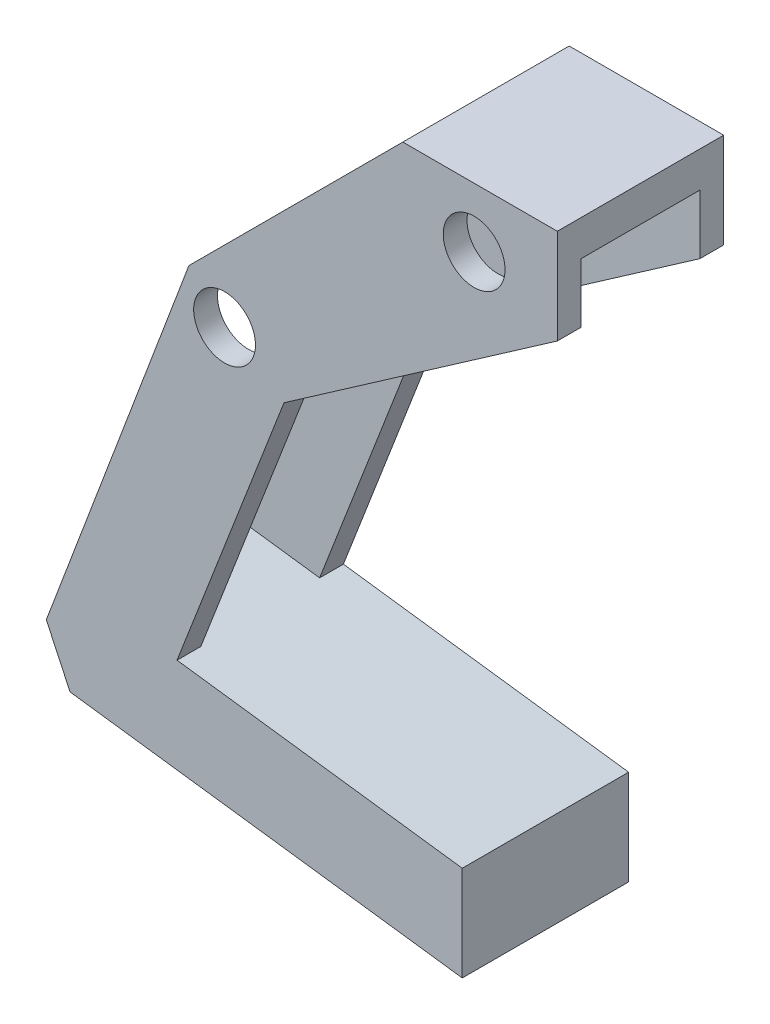
ISO-10303-21;
HEADER;
FILE_DESCRIPTION(('STEP AP214'),'2;1');
FILE_NAME('part.step','',(''),(''),'','','');
FILE_SCHEMA(('AUTOMOTIVE_DESIGN { 1 0 10303 214 1 1 1 1 }'));
ENDSEC;
DATA;
#1=APPLICATION_CONTEXT('core data for automotive mechanical design processes');
#2=APPLICATION_PROTOCOL_DEFINITION('international standard','automotive_design',2000,#1);
#3=PRODUCT_CONTEXT('',#1,'mechanical');
#4=PRODUCT('Part','Part','',(#3));
#5=PRODUCT_RELATED_PRODUCT_CATEGORY('part','',(#4));
#6=PRODUCT_DEFINITION_FORMATION('','',#4);
#7=PRODUCT_DEFINITION_CONTEXT('part definition',#1,'design');
#8=PRODUCT_DEFINITION('design','',#6,#7);
#9=PRODUCT_DEFINITION_SHAPE('','',#8);
#10=(LENGTH_UNIT() NAMED_UNIT(*) SI_UNIT(.MILLI.,.METRE.));
#11=(NAMED_UNIT(*) PLANE_ANGLE_UNIT() SI_UNIT($,.RADIAN.));
#12=(NAMED_UNIT(*) SI_UNIT($,.STERADIAN.) SOLID_ANGLE_UNIT());
#13=UNCERTAINTY_MEASURE_WITH_UNIT(LENGTH_MEASURE(1.E-05),#10,'distance_accuracy_value','');
#14=(GEOMETRIC_REPRESENTATION_CONTEXT(3) GLOBAL_UNCERTAINTY_ASSIGNED_CONTEXT((#13)) GLOBAL_UNIT_ASSIGNED_CONTEXT((#10,
#11,#12)) REPRESENTATION_CONTEXT('',''));
#15=CARTESIAN_POINT('',(0.,0.,0.));
#16=DIRECTION('',(0.,0.,1.));
#17=DIRECTION('',(1.,0.,0.));
#18=AXIS2_PLACEMENT_3D('',#15,#16,#17);
#19=CARTESIAN_POINT('',(-65.,57.,2.));
#20=DIRECTION('',(0.,1.,0.));
#21=DIRECTION('',(0.,0.,1.));
#22=AXIS2_PLACEMENT_3D('',#19,#20,#21);
#23=PLANE('',#22);
#24=DIRECTION('',(-1.,0.,0.));
#25=VECTOR('',#24,1.);
#26=CARTESIAN_POINT('',(-65.,57.,2.));
#27=LINE('',#26,#25);
#28=CARTESIAN_POINT('',(-20.6613247725836,57.,2.));
#29=VERTEX_POINT('',#28);
#30=CARTESIAN_POINT('',(-28.,57.,2.));
#31=VERTEX_POINT('',#30);
#32=EDGE_CURVE('E179',#29,#31,#27,.T.);
#33=ORIENTED_EDGE('',*,*,#32,.F.);
#34=DIRECTION('',(0.,0.,1.));
#35=VECTOR('',#34,1.);
#36=CARTESIAN_POINT('',(-20.6613247725836,57.,0.));
#37=LINE('',#36,#35);
#38=CARTESIAN_POINT('',(-20.6613247725836,57.,12.));
#39=VERTEX_POINT('',#38);
#40=EDGE_CURVE('E169',#29,#39,#37,.T.);
#41=ORIENTED_EDGE('',*,*,#40,.T.);
#42=DIRECTION('',(-1.,0.,0.));
#43=VECTOR('',#42,1.);
#44=CARTESIAN_POINT('',(-65.,57.,12.));
#45=LINE('',#44,#43);
#46=CARTESIAN_POINT('',(-28.,57.,12.));
#47=VERTEX_POINT('',#46);
#48=EDGE_CURVE('E177',#39,#47,#45,.T.);
#49=ORIENTED_EDGE('',*,*,#48,.T.);
#50=DIRECTION('',(0.,0.,1.));
#51=VECTOR('',#50,1.);
#52=CARTESIAN_POINT('',(-28.,57.,14.));
#53=LINE('',#52,#51);
#54=EDGE_CURVE('E47',#31,#47,#53,.T.);
#55=ORIENTED_EDGE('',*,*,#54,.F.);
#56=EDGE_LOOP('',(#33,#41,#49,#55));
#57=FACE_BOUND('',#56,.T.);
#58=ADVANCED_FACE('F39',(#57),#23,.F.);
#59=CARTESIAN_POINT('',(-12.,52.,14.));
#60=DIRECTION('',(-1.,0.,0.));
#61=DIRECTION('',(0.,0.,1.));
#62=AXIS2_PLACEMENT_3D('',#59,#60,#61);
#63=PLANE('',#62);
#64=DIRECTION('',(0.,1.,0.));
#65=VECTOR('',#64,1.);
#66=CARTESIAN_POINT('',(-12.,52.,2.));
#67=LINE('',#66,#65);
#68=CARTESIAN_POINT('',(-12.,52.,2.));
#69=VERTEX_POINT('',#68);
#70=CARTESIAN_POINT('',(-12.,57.,2.));
#71=VERTEX_POINT('',#70);
#72=EDGE_CURVE('E209',#69,#71,#67,.T.);
#73=ORIENTED_EDGE('',*,*,#72,.F.);
#74=DIRECTION('',(0.,0.,-1.));
#75=VECTOR('',#74,1.);
#76=CARTESIAN_POINT('',(-12.,52.,14.));
#77=LINE('',#76,#75);
#78=CARTESIAN_POINT('',(-12.,52.,0.));
#79=VERTEX_POINT('',#78);
#80=EDGE_CURVE('E244',#69,#79,#77,.T.);
#81=ORIENTED_EDGE('',*,*,#80,.T.);
#82=DIRECTION('',(0.,1.,0.));
#83=VECTOR('',#82,1.);
#84=CARTESIAN_POINT('',(-12.,52.,0.));
#85=LINE('',#84,#83);
#86=CARTESIAN_POINT('',(-12.,60.,0.));
#87=VERTEX_POINT('',#86);
#88=EDGE_CURVE('E221',#79,#87,#85,.T.);
#89=ORIENTED_EDGE('',*,*,#88,.T.);
#90=DIRECTION('',(0.,0.,-1.));
#91=VECTOR('',#90,1.);
#92=CARTESIAN_POINT('',(-12.,60.,14.));
#93=LINE('',#92,#91);
#94=CARTESIAN_POINT('',(-12.,60.,14.));
#95=VERTEX_POINT('',#94);
#96=EDGE_CURVE('E298',#95,#87,#93,.T.);
#97=ORIENTED_EDGE('',*,*,#96,.F.);
#98=DIRECTION('',(0.,1.,0.));
#99=VECTOR('',#98,1.);
#100=CARTESIAN_POINT('',(-12.,52.,14.));
#101=LINE('',#100,#99);
#102=CARTESIAN_POINT('',(-12.,52.,14.));
#103=VERTEX_POINT('',#102);
#104=EDGE_CURVE('E222',#103,#95,#101,.T.);
#105=ORIENTED_EDGE('',*,*,#104,.F.);
#106=CARTESIAN_POINT('',(-12.,52.,12.));
#107=VERTEX_POINT('',#106);
#108=EDGE_CURVE('E269',#103,#107,#77,.T.);
#109=ORIENTED_EDGE('',*,*,#108,.T.);
#110=DIRECTION('',(0.,1.,0.));
#111=VECTOR('',#110,1.);
#112=CARTESIAN_POINT('',(-12.,52.,12.));
#113=LINE('',#112,#111);
#114=CARTESIAN_POINT('',(-12.,57.,12.));
#115=VERTEX_POINT('',#114);
#116=EDGE_CURVE('E200',#107,#115,#113,.T.);
#117=ORIENTED_EDGE('',*,*,#116,.T.);
#118=DIRECTION('',(0.,0.,-1.));
#119=VECTOR('',#118,1.);
#120=CARTESIAN_POINT('',(-12.,57.,14.));
#121=LINE('',#120,#119);
#122=EDGE_CURVE('E218',#115,#71,#121,.T.);
#123=ORIENTED_EDGE('',*,*,#122,.T.);
#124=EDGE_LOOP('',(#73,#81,#89,#97,#105,#109,#117,#123));
#125=FACE_BOUND('',#124,.T.);
#126=ADVANCED_FACE('F41',(#125),#63,.F.);
#127=CARTESIAN_POINT('',(-25.,60.,14.));
#128=DIRECTION('',(0.707106781186548,-0.707106781186548,0.));
#129=DIRECTION('',(0.707106781186548,0.707106781186548,0.));
#130=AXIS2_PLACEMENT_3D('',#127,#128,#129);
#131=PLANE('',#130);
#132=DIRECTION('',(-0.707106781186548,-0.707106781186548,0.));
#133=VECTOR('',#132,1.);
#134=CARTESIAN_POINT('',(-25.,60.,2.));
#135=LINE('',#134,#133);
#136=CARTESIAN_POINT('',(-43.,42.,2.));
#137=VERTEX_POINT('',#136);
#138=EDGE_CURVE('E213',#31,#137,#135,.T.);
#139=ORIENTED_EDGE('',*,*,#138,.F.);
#140=ORIENTED_EDGE('',*,*,#54,.T.);
#141=DIRECTION('',(-0.707106781186548,-0.707106781186548,0.));
#142=VECTOR('',#141,1.);
#143=CARTESIAN_POINT('',(-25.,60.,12.));
#144=LINE('',#143,#142);
#145=CARTESIAN_POINT('',(-43.,42.,12.));
#146=VERTEX_POINT('',#145);
#147=EDGE_CURVE('E184',#47,#146,#144,.T.);
#148=ORIENTED_EDGE('',*,*,#147,.T.);
#149=DIRECTION('',(0.,0.,-1.));
#150=VECTOR('',#149,1.);
#151=CARTESIAN_POINT('',(-43.,42.,14.));
#152=LINE('',#151,#150);
#153=CARTESIAN_POINT('',(-43.,42.,14.));
#154=VERTEX_POINT('',#153);
#155=EDGE_CURVE('E292',#154,#146,#152,.T.);
#156=ORIENTED_EDGE('',*,*,#155,.F.);
#157=DIRECTION('',(-0.707106781186547,-0.707106781186547,0.));
#158=VECTOR('',#157,1.);
#159=CARTESIAN_POINT('',(-25.,60.,14.));
#160=LINE('',#159,#158);
#161=CARTESIAN_POINT('',(-25.,60.,14.));
#162=VERTEX_POINT('',#161);
#163=EDGE_CURVE('E228',#162,#154,#160,.T.);
#164=ORIENTED_EDGE('',*,*,#163,.F.);
#165=DIRECTION('',(0.,0.,-1.));
#166=VECTOR('',#165,1.);
#167=CARTESIAN_POINT('',(-25.,60.,14.));
#168=LINE('',#167,#166);
#169=CARTESIAN_POINT('',(-25.,60.,0.));
#170=VERTEX_POINT('',#169);
#171=EDGE_CURVE('E295',#162,#170,#168,.T.);
#172=ORIENTED_EDGE('',*,*,#171,.T.);
#173=DIRECTION('',(-0.707106781186547,-0.707106781186547,0.));
#174=VECTOR('',#173,1.);
#175=CARTESIAN_POINT('',(-25.,60.,0.));
#176=LINE('',#175,#174);
#177=CARTESIAN_POINT('',(-43.,42.,0.));
#178=VERTEX_POINT('',#177);
#179=EDGE_CURVE('E249',#170,#178,#176,.T.);
#180=ORIENTED_EDGE('',*,*,#179,.T.);
#181=EDGE_CURVE('E291',#137,#178,#152,.T.);
#182=ORIENTED_EDGE('',*,*,#181,.F.);
#183=EDGE_LOOP('',(#139,#140,#148,#156,#164,#172,#180,#182));
#184=FACE_BOUND('',#183,.T.);
#185=ADVANCED_FACE('F328',(#184),#131,.F.);
#186=CARTESIAN_POINT('',(-43.,42.,14.));
#187=DIRECTION('',(0.935646924127684,-0.352937435490208,0.));
#188=DIRECTION('',(0.352937435490208,0.935646924127684,0.));
#189=AXIS2_PLACEMENT_3D('',#186,#187,#188);
#190=PLANE('',#189);
#191=DIRECTION('',(-0.352937435490208,-0.935646924127684,0.));
#192=VECTOR('',#191,1.);
#193=CARTESIAN_POINT('',(-43.,42.,2.));
#194=LINE('',#193,#192);
#195=CARTESIAN_POINT('',(-53.5625369462484,13.9984217853916,2.));
#196=VERTEX_POINT('',#195);
#197=EDGE_CURVE('E211',#137,#196,#194,.T.);
#198=ORIENTED_EDGE('',*,*,#197,.F.);
#199=ORIENTED_EDGE('',*,*,#181,.T.);
#200=DIRECTION('',(-0.352937435490208,-0.935646924127684,0.));
#201=VECTOR('',#200,1.);
#202=CARTESIAN_POINT('',(-43.,42.,0.));
#203=LINE('',#202,#201);
#204=CARTESIAN_POINT('',(-55.,10.1876673866076,0.));
#205=VERTEX_POINT('',#204);
#206=EDGE_CURVE('E252',#178,#205,#203,.T.);
#207=ORIENTED_EDGE('',*,*,#206,.T.);
#208=DIRECTION('',(0.,0.,-1.));
#209=VECTOR('',#208,1.);
#210=CARTESIAN_POINT('',(-55.,10.1876673866076,14.));
#211=LINE('',#210,#209);
#212=CARTESIAN_POINT('',(-55.,10.1876673866076,14.));
#213=VERTEX_POINT('',#212);
#214=EDGE_CURVE('E288',#213,#205,#211,.T.);
#215=ORIENTED_EDGE('',*,*,#214,.F.);
#216=DIRECTION('',(-0.352937435490208,-0.935646924127684,0.));
#217=VECTOR('',#216,1.);
#218=CARTESIAN_POINT('',(-43.,42.,14.));
#219=LINE('',#218,#217);
#220=EDGE_CURVE('E230',#154,#213,#219,.T.);
#221=ORIENTED_EDGE('',*,*,#220,.F.);
#222=ORIENTED_EDGE('',*,*,#155,.T.);
#223=DIRECTION('',(-0.352937435490208,-0.935646924127684,0.));
#224=VECTOR('',#223,1.);
#225=CARTESIAN_POINT('',(-43.,42.,12.));
#226=LINE('',#225,#224);
#227=CARTESIAN_POINT('',(-53.5625369462484,13.9984217853916,12.));
#228=VERTEX_POINT('',#227);
#229=EDGE_CURVE('E203',#146,#228,#226,.T.);
#230=ORIENTED_EDGE('',*,*,#229,.T.);
#231=DIRECTION('',(0.,0.,-1.));
#232=VECTOR('',#231,1.);
#233=CARTESIAN_POINT('',(-53.5625369462484,13.9984217853916,14.));
#234=LINE('',#233,#232);
#235=EDGE_CURVE('E215',#228,#196,#234,.T.);
#236=ORIENTED_EDGE('',*,*,#235,.T.);
#237=EDGE_LOOP('',(#198,#199,#207,#215,#221,#222,#230,#236));
#238=FACE_BOUND('',#237,.T.);
#239=ADVANCED_FACE('F332',(#238),#190,.F.);
#240=CARTESIAN_POINT('',(-44.,12.7394899131463,14.));
#241=DIRECTION('',(-0.932623002789676,0.360852233840346,0.));
#242=DIRECTION('',(-0.360852233840346,-0.932623002789676,0.));
#243=AXIS2_PLACEMENT_3D('',#240,#241,#242);
#244=PLANE('',#243);
#245=DIRECTION('',(0.360852233840346,0.932623002789676,0.));
#246=VECTOR('',#245,1.);
#247=CARTESIAN_POINT('',(-44.,12.7394899131463,2.));
#248=LINE('',#247,#246);
#249=CARTESIAN_POINT('',(-44.,12.7394899131462,2.));
#250=VERTEX_POINT('',#249);
#251=CARTESIAN_POINT('',(-35.,36.,2.));
#252=VERTEX_POINT('',#251);
#253=EDGE_CURVE('E207',#250,#252,#248,.T.);
#254=ORIENTED_EDGE('',*,*,#253,.F.);
#255=DIRECTION('',(0.,0.,-1.));
#256=VECTOR('',#255,1.);
#257=CARTESIAN_POINT('',(-44.,12.7394899131463,14.));
#258=LINE('',#257,#256);
#259=CARTESIAN_POINT('',(-44.,12.7394899131463,0.));
#260=VERTEX_POINT('',#259);
#261=EDGE_CURVE('E276',#250,#260,#258,.T.);
#262=ORIENTED_EDGE('',*,*,#261,.T.);
#263=DIRECTION('',(0.360852233840346,0.932623002789676,0.));
#264=VECTOR('',#263,1.);
#265=CARTESIAN_POINT('',(-44.,12.7394899131463,0.));
#266=LINE('',#265,#264);
#267=CARTESIAN_POINT('',(-35.,36.,0.));
#268=VERTEX_POINT('',#267);
#269=EDGE_CURVE('E264',#260,#268,#266,.T.);
#270=ORIENTED_EDGE('',*,*,#269,.T.);
#271=DIRECTION('',(0.,0.,-1.));
#272=VECTOR('',#271,1.);
#273=CARTESIAN_POINT('',(-35.,36.,14.));
#274=LINE('',#273,#272);
#275=EDGE_CURVE('E272',#252,#268,#274,.T.);
#276=ORIENTED_EDGE('',*,*,#275,.F.);
#277=EDGE_LOOP('',(#254,#262,#270,#276));
#278=FACE_BOUND('',#277,.T.);
#279=ADVANCED_FACE('F342',(#278),#244,.F.);
#280=CARTESIAN_POINT('',(-35.,36.,14.));
#281=DIRECTION('',(-0.5710644881986,0.820905201785487,0.));
#282=DIRECTION('',(-0.820905201785487,-0.5710644881986,0.));
#283=AXIS2_PLACEMENT_3D('',#280,#281,#282);
#284=PLANE('',#283);
#285=DIRECTION('',(0.820905201785487,0.5710644881986,0.));
#286=VECTOR('',#285,1.);
#287=CARTESIAN_POINT('',(-35.,36.,2.));
#288=LINE('',#287,#286);
#289=EDGE_CURVE('E304',#252,#69,#288,.T.);
#290=ORIENTED_EDGE('',*,*,#289,.F.);
#291=ORIENTED_EDGE('',*,*,#275,.T.);
#292=DIRECTION('',(0.820905201785487,0.5710644881986,0.));
#293=VECTOR('',#292,1.);
#294=CARTESIAN_POINT('',(-35.,36.,0.));
#295=LINE('',#294,#293);
#296=EDGE_CURVE('E226',#268,#79,#295,.T.);
#297=ORIENTED_EDGE('',*,*,#296,.T.);
#298=ORIENTED_EDGE('',*,*,#80,.F.);
#299=EDGE_LOOP('',(#290,#291,#297,#298));
#300=FACE_BOUND('',#299,.T.);
#301=ADVANCED_FACE('F349',(#300),#284,.F.);
#302=CARTESIAN_POINT('',(-12.,60.,14.));
#303=DIRECTION('',(0.,-1.,0.));
#304=DIRECTION('',(0.,0.,-1.));
#305=AXIS2_PLACEMENT_3D('',#302,#303,#304);
#306=PLANE('',#305);
#307=DIRECTION('',(-1.,0.,0.));
#308=VECTOR('',#307,1.);
#309=CARTESIAN_POINT('',(-12.,60.,0.));
#310=LINE('',#309,#308);
#311=EDGE_CURVE('E247',#87,#170,#310,.T.);
#312=ORIENTED_EDGE('',*,*,#311,.T.);
#313=ORIENTED_EDGE('',*,*,#171,.F.);
#314=DIRECTION('',(-1.,0.,0.));
#315=VECTOR('',#314,1.);
#316=CARTESIAN_POINT('',(-12.,60.,14.));
#317=LINE('',#316,#315);
#318=EDGE_CURVE('E225',#95,#162,#317,.T.);
#319=ORIENTED_EDGE('',*,*,#318,.F.);
#320=ORIENTED_EDGE('',*,*,#96,.T.);
#321=EDGE_LOOP('',(#312,#313,#319,#320));
#322=FACE_BOUND('',#321,.T.);
#323=ADVANCED_FACE('F378',(#322),#306,.F.);
#324=CARTESIAN_POINT('',(-55.,10.1876673866076,14.));
#325=DIRECTION('',(0.905330295868163,0.424708200277867,0.));
#326=DIRECTION('',(-0.424708200277867,0.905330295868163,0.));
#327=AXIS2_PLACEMENT_3D('',#324,#325,#326);
#328=PLANE('',#327);
#329=DIRECTION('',(0.424708200277867,-0.905330295868163,0.));
#330=VECTOR('',#329,1.);
#331=CARTESIAN_POINT('',(-55.,10.1876673866076,0.));
#332=LINE('',#331,#330);
#333=CARTESIAN_POINT('',(-53.,5.92436239143281,0.));
#334=VERTEX_POINT('',#333);
#335=EDGE_CURVE('E254',#205,#334,#332,.T.);
#336=ORIENTED_EDGE('',*,*,#335,.T.);
#337=DIRECTION('',(0.,0.,-1.));
#338=VECTOR('',#337,1.);
#339=CARTESIAN_POINT('',(-53.,5.92436239143281,14.));
#340=LINE('',#339,#338);
#341=CARTESIAN_POINT('',(-53.,5.92436239143281,14.));
#342=VERTEX_POINT('',#341);
#343=EDGE_CURVE('E285',#342,#334,#340,.T.);
#344=ORIENTED_EDGE('',*,*,#343,.F.);
#345=DIRECTION('',(0.424708200277867,-0.905330295868163,0.));
#346=VECTOR('',#345,1.);
#347=CARTESIAN_POINT('',(-55.,10.1876673866076,14.));
#348=LINE('',#347,#346);
#349=EDGE_CURVE('E232',#213,#342,#348,.T.);
#350=ORIENTED_EDGE('',*,*,#349,.F.);
#351=ORIENTED_EDGE('',*,*,#214,.T.);
#352=EDGE_LOOP('',(#336,#344,#350,#351));
#353=FACE_BOUND('',#352,.T.);
#354=ADVANCED_FACE('F386',(#353),#328,.F.);
#355=CARTESIAN_POINT('',(-53.,5.92436239143281,14.));
#356=DIRECTION('',(0.130526192220052,0.99144486137381,0.));
#357=DIRECTION('',(-0.99144486137381,0.130526192220052,0.));
#358=AXIS2_PLACEMENT_3D('',#355,#356,#357);
#359=PLANE('',#358);
#360=DIRECTION('',(0.99144486137381,-0.130526192220052,0.));
#361=VECTOR('',#360,1.);
#362=CARTESIAN_POINT('',(-53.,5.92436239143281,0.));
#363=LINE('',#362,#361);
#364=CARTESIAN_POINT('',(-20.,1.57982997104875,0.));
#365=VERTEX_POINT('',#364);
#366=EDGE_CURVE('E256',#334,#365,#363,.T.);
#367=ORIENTED_EDGE('',*,*,#366,.T.);
#368=DIRECTION('',(0.,0.,-1.));
#369=VECTOR('',#368,1.);
#370=CARTESIAN_POINT('',(-20.,1.57982997104875,14.));
#371=LINE('',#370,#369);
#372=CARTESIAN_POINT('',(-20.,1.57982997104875,14.));
#373=VERTEX_POINT('',#372);
#374=EDGE_CURVE('E282',#373,#365,#371,.T.);
#375=ORIENTED_EDGE('',*,*,#374,.F.);
#376=DIRECTION('',(0.99144486137381,-0.130526192220052,0.));
#377=VECTOR('',#376,1.);
#378=CARTESIAN_POINT('',(-53.,5.92436239143281,14.));
#379=LINE('',#378,#377);
#380=EDGE_CURVE('E234',#342,#373,#379,.T.);
#381=ORIENTED_EDGE('',*,*,#380,.F.);
#382=ORIENTED_EDGE('',*,*,#343,.T.);
#383=EDGE_LOOP('',(#367,#375,#381,#382));
#384=FACE_BOUND('',#383,.T.);
#385=ADVANCED_FACE('F391',(#384),#359,.F.);
#386=CARTESIAN_POINT('',(-20.,1.57982997104875,14.));
#387=DIRECTION('',(-1.,0.,0.));
#388=DIRECTION('',(0.,0.,1.));
#389=AXIS2_PLACEMENT_3D('',#386,#387,#388);
#390=PLANE('',#389);
#391=DIRECTION('',(0.,1.,0.));
#392=VECTOR('',#391,1.);
#393=CARTESIAN_POINT('',(-20.,1.57982997104875,0.));
#394=LINE('',#393,#392);
#395=CARTESIAN_POINT('',(-20.,9.57982997104875,0.));
#396=VERTEX_POINT('',#395);
#397=EDGE_CURVE('E258',#365,#396,#394,.T.);
#398=ORIENTED_EDGE('',*,*,#397,.T.);
#399=DIRECTION('',(0.,0.,-1.));
#400=VECTOR('',#399,1.);
#401=CARTESIAN_POINT('',(-20.,9.57982997104875,14.));
#402=LINE('',#401,#400);
#403=CARTESIAN_POINT('',(-20.,9.57982997104875,14.));
#404=VERTEX_POINT('',#403);
#405=EDGE_CURVE('E280',#404,#396,#402,.T.);
#406=ORIENTED_EDGE('',*,*,#405,.F.);
#407=DIRECTION('',(0.,1.,0.));
#408=VECTOR('',#407,1.);
#409=CARTESIAN_POINT('',(-20.,1.57982997104875,14.));
#410=LINE('',#409,#408);
#411=EDGE_CURVE('E236',#373,#404,#410,.T.);
#412=ORIENTED_EDGE('',*,*,#411,.F.);
#413=ORIENTED_EDGE('',*,*,#374,.T.);
#414=EDGE_LOOP('',(#398,#406,#412,#413));
#415=FACE_BOUND('',#414,.T.);
#416=ADVANCED_FACE('F397',(#415),#390,.F.);
#417=CARTESIAN_POINT('',(-20.,9.57982997104875,14.));
#418=DIRECTION('',(-0.130526192220052,-0.99144486137381,0.));
#419=DIRECTION('',(0.99144486137381,-0.130526192220052,0.));
#420=AXIS2_PLACEMENT_3D('',#417,#418,#419);
#421=PLANE('',#420);
#422=ORIENTED_EDGE('',*,*,#405,.T.);
#423=DIRECTION('',(-0.99144486137381,0.130526192220052,0.));
#424=VECTOR('',#423,1.);
#425=CARTESIAN_POINT('',(-20.,9.57982997104875,0.));
#426=LINE('',#425,#424);
#427=EDGE_CURVE('E261',#396,#260,#426,.T.);
#428=ORIENTED_EDGE('',*,*,#427,.T.);
#429=ORIENTED_EDGE('',*,*,#261,.F.);
#430=DIRECTION('',(0.99144486137381,-0.130526192220052,0.));
#431=VECTOR('',#430,1.);
#432=CARTESIAN_POINT('',(5.,6.28851753136385,2.));
#433=LINE('',#432,#431);
#434=EDGE_CURVE('E194',#196,#250,#433,.T.);
#435=ORIENTED_EDGE('',*,*,#434,.F.);
#436=ORIENTED_EDGE('',*,*,#235,.F.);
#437=DIRECTION('',(0.99144486137381,-0.130526192220052,0.));
#438=VECTOR('',#437,1.);
#439=CARTESIAN_POINT('',(5.,6.28851753136385,12.));
#440=LINE('',#439,#438);
#441=CARTESIAN_POINT('',(-44.,12.7394899131462,12.));
#442=VERTEX_POINT('',#441);
#443=EDGE_CURVE('E61',#228,#442,#440,.T.);
#444=ORIENTED_EDGE('',*,*,#443,.T.);
#445=CARTESIAN_POINT('',(-44.,12.7394899131463,14.));
#446=VERTEX_POINT('',#445);
#447=EDGE_CURVE('E277',#446,#442,#258,.T.);
#448=ORIENTED_EDGE('',*,*,#447,.F.);
#449=DIRECTION('',(-0.99144486137381,0.130526192220052,0.));
#450=VECTOR('',#449,1.);
#451=CARTESIAN_POINT('',(-20.,9.57982997104875,14.));
#452=LINE('',#451,#450);
#453=EDGE_CURVE('E238',#404,#446,#452,.T.);
#454=ORIENTED_EDGE('',*,*,#453,.F.);
#455=EDGE_LOOP('',(#422,#428,#429,#435,#436,#444,#448,#454));
#456=FACE_BOUND('',#455,.T.);
#457=ADVANCED_FACE('F338',(#456),#421,.F.);
#458=ORIENTED_EDGE('',*,*,#447,.T.);
#459=DIRECTION('',(0.360852233840346,0.932623002789676,0.));
#460=VECTOR('',#459,1.);
#461=CARTESIAN_POINT('',(-44.,12.7394899131463,12.));
#462=LINE('',#461,#460);
#463=CARTESIAN_POINT('',(-35.,36.,12.));
#464=VERTEX_POINT('',#463);
#465=EDGE_CURVE('E197',#442,#464,#462,.T.);
#466=ORIENTED_EDGE('',*,*,#465,.T.);
#467=CARTESIAN_POINT('',(-35.,36.,14.));
#468=VERTEX_POINT('',#467);
#469=EDGE_CURVE('E273',#468,#464,#274,.T.);
#470=ORIENTED_EDGE('',*,*,#469,.F.);
#471=DIRECTION('',(0.360852233840346,0.932623002789676,0.));
#472=VECTOR('',#471,1.);
#473=CARTESIAN_POINT('',(-44.,12.7394899131463,14.));
#474=LINE('',#473,#472);
#475=EDGE_CURVE('E240',#446,#468,#474,.T.);
#476=ORIENTED_EDGE('',*,*,#475,.F.);
#477=EDGE_LOOP('',(#458,#466,#470,#476));
#478=FACE_BOUND('',#477,.T.);
#479=ADVANCED_FACE('F402',(#478),#244,.F.);
#480=ORIENTED_EDGE('',*,*,#469,.T.);
#481=DIRECTION('',(0.820905201785487,0.5710644881986,0.));
#482=VECTOR('',#481,1.);
#483=CARTESIAN_POINT('',(-35.,36.,12.));
#484=LINE('',#483,#482);
#485=EDGE_CURVE('E301',#464,#107,#484,.T.);
#486=ORIENTED_EDGE('',*,*,#485,.T.);
#487=ORIENTED_EDGE('',*,*,#108,.F.);
#488=DIRECTION('',(0.820905201785487,0.5710644881986,0.));
#489=VECTOR('',#488,1.);
#490=CARTESIAN_POINT('',(-35.,36.,14.));
#491=LINE('',#490,#489);
#492=EDGE_CURVE('E242',#468,#103,#491,.T.);
#493=ORIENTED_EDGE('',*,*,#492,.F.);
#494=EDGE_LOOP('',(#480,#486,#487,#493));
#495=FACE_BOUND('',#494,.T.);
#496=ADVANCED_FACE('F369',(#495),#284,.F.);
#497=CARTESIAN_POINT('',(0.,0.,14.));
#498=DIRECTION('',(0.,0.,1.));
#499=DIRECTION('',(1.,0.,0.));
#500=AXIS2_PLACEMENT_3D('',#497,#498,#499);
#501=PLANE('',#500);
#502=CARTESIAN_POINT('',(-19.,55.,14.));
#503=DIRECTION('',(0.,0.,1.));
#504=DIRECTION('',(1.,0.,0.));
#505=AXIS2_PLACEMENT_3D('',#502,#503,#504);
#506=CIRCLE('',#505,2.6);
#507=CARTESIAN_POINT('',(-16.4,55.,14.));
#508=VERTEX_POINT('',#507);
#509=EDGE_CURVE('E358',#508,#508,#506,.T.);
#510=ORIENTED_EDGE('',*,*,#509,.F.);
#511=EDGE_LOOP('',(#510));
#512=FACE_BOUND('',#511,.T.);
#513=CARTESIAN_POINT('',(-40.,39.,14.));
#514=DIRECTION('',(0.,0.,1.));
#515=DIRECTION('',(1.,0.,0.));
#516=AXIS2_PLACEMENT_3D('',#513,#514,#515);
#517=CIRCLE('',#516,2.6);
#518=CARTESIAN_POINT('',(-37.4,39.,14.));
#519=VERTEX_POINT('',#518);
#520=EDGE_CURVE('E311',#519,#519,#517,.T.);
#521=ORIENTED_EDGE('',*,*,#520,.F.);
#522=EDGE_LOOP('',(#521));
#523=FACE_BOUND('',#522,.T.);
#524=ORIENTED_EDGE('',*,*,#104,.T.);
#525=ORIENTED_EDGE('',*,*,#318,.T.);
#526=ORIENTED_EDGE('',*,*,#163,.T.);
#527=ORIENTED_EDGE('',*,*,#220,.T.);
#528=ORIENTED_EDGE('',*,*,#349,.T.);
#529=ORIENTED_EDGE('',*,*,#380,.T.);
#530=ORIENTED_EDGE('',*,*,#411,.T.);
#531=ORIENTED_EDGE('',*,*,#453,.T.);
#532=ORIENTED_EDGE('',*,*,#475,.T.);
#533=ORIENTED_EDGE('',*,*,#492,.T.);
#534=EDGE_LOOP('',(#524,#525,#526,#527,#528,#529,#530,#531,#532,#533));
#535=FACE_BOUND('',#534,.T.);
#536=ADVANCED_FACE('F365',(#512,#523,#535),#501,.T.);
#537=CARTESIAN_POINT('',(0.,0.,0.));
#538=DIRECTION('',(0.,0.,1.));
#539=DIRECTION('',(1.,0.,0.));
#540=AXIS2_PLACEMENT_3D('',#537,#538,#539);
#541=PLANE('',#540);
#542=CARTESIAN_POINT('',(-19.,55.,0.));
#543=DIRECTION('',(0.,0.,1.));
#544=DIRECTION('',(1.,0.,0.));
#545=AXIS2_PLACEMENT_3D('',#542,#543,#544);
#546=CIRCLE('',#545,2.6);
#547=CARTESIAN_POINT('',(-16.4,55.,0.));
#548=VERTEX_POINT('',#547);
#549=EDGE_CURVE('E355',#548,#548,#546,.T.);
#550=ORIENTED_EDGE('',*,*,#549,.T.);
#551=EDGE_LOOP('',(#550));
#552=FACE_BOUND('',#551,.T.);
#553=CARTESIAN_POINT('',(-40.,39.,0.));
#554=DIRECTION('',(0.,0.,1.));
#555=DIRECTION('',(1.,0.,0.));
#556=AXIS2_PLACEMENT_3D('',#553,#554,#555);
#557=CIRCLE('',#556,2.6);
#558=CARTESIAN_POINT('',(-37.4,39.,0.));
#559=VERTEX_POINT('',#558);
#560=EDGE_CURVE('E307',#559,#559,#557,.T.);
#561=ORIENTED_EDGE('',*,*,#560,.T.);
#562=EDGE_LOOP('',(#561));
#563=FACE_BOUND('',#562,.T.);
#564=ORIENTED_EDGE('',*,*,#88,.F.);
#565=ORIENTED_EDGE('',*,*,#296,.F.);
#566=ORIENTED_EDGE('',*,*,#269,.F.);
#567=ORIENTED_EDGE('',*,*,#427,.F.);
#568=ORIENTED_EDGE('',*,*,#397,.F.);
#569=ORIENTED_EDGE('',*,*,#366,.F.);
#570=ORIENTED_EDGE('',*,*,#335,.F.);
#571=ORIENTED_EDGE('',*,*,#206,.F.);
#572=ORIENTED_EDGE('',*,*,#179,.F.);
#573=ORIENTED_EDGE('',*,*,#311,.F.);
#574=EDGE_LOOP('',(#564,#565,#566,#567,#568,#569,#570,#571,#572,#573));
#575=FACE_BOUND('',#574,.T.);
#576=ADVANCED_FACE('F368',(#552,#563,#575),#541,.F.);
#577=CARTESIAN_POINT('',(-17.3386752274164,57.,12.));
#578=VERTEX_POINT('',#577);
#579=EDGE_CURVE('E186',#115,#578,#45,.T.);
#580=ORIENTED_EDGE('',*,*,#579,.T.);
#581=DIRECTION('',(0.,0.,1.));
#582=VECTOR('',#581,1.);
#583=CARTESIAN_POINT('',(-17.3386752274164,57.,0.));
#584=LINE('',#583,#582);
#585=CARTESIAN_POINT('',(-17.3386752274164,57.,2.));
#586=VERTEX_POINT('',#585);
#587=EDGE_CURVE('E54',#578,#586,#584,.F.);
#588=ORIENTED_EDGE('',*,*,#587,.T.);
#589=EDGE_CURVE('E318',#71,#586,#27,.T.);
#590=ORIENTED_EDGE('',*,*,#589,.F.);
#591=ORIENTED_EDGE('',*,*,#122,.F.);
#592=EDGE_LOOP('',(#580,#588,#590,#591));
#593=FACE_BOUND('',#592,.T.);
#594=ADVANCED_FACE('F354',(#593),#23,.F.);
#595=CARTESIAN_POINT('',(0.,0.,2.));
#596=DIRECTION('',(0.,0.,1.));
#597=DIRECTION('',(1.,0.,0.));
#598=AXIS2_PLACEMENT_3D('',#595,#596,#597);
#599=PLANE('',#598);
#600=CARTESIAN_POINT('',(-19.,55.,2.));
#601=DIRECTION('',(0.,0.,1.));
#602=DIRECTION('',(1.,0.,0.));
#603=AXIS2_PLACEMENT_3D('',#600,#601,#602);
#604=CIRCLE('',#603,2.6);
#605=EDGE_CURVE('E180',#29,#586,#604,.T.);
#606=ORIENTED_EDGE('',*,*,#605,.F.);
#607=ORIENTED_EDGE('',*,*,#32,.T.);
#608=ORIENTED_EDGE('',*,*,#138,.T.);
#609=ORIENTED_EDGE('',*,*,#197,.T.);
#610=ORIENTED_EDGE('',*,*,#434,.T.);
#611=ORIENTED_EDGE('',*,*,#253,.T.);
#612=ORIENTED_EDGE('',*,*,#289,.T.);
#613=ORIENTED_EDGE('',*,*,#72,.T.);
#614=ORIENTED_EDGE('',*,*,#589,.T.);
#615=EDGE_LOOP('',(#606,#607,#608,#609,#610,#611,#612,#613,#614));
#616=FACE_BOUND('',#615,.T.);
#617=CARTESIAN_POINT('',(-40.,39.,2.));
#618=DIRECTION('',(0.,0.,1.));
#619=DIRECTION('',(1.,0.,0.));
#620=AXIS2_PLACEMENT_3D('',#617,#618,#619);
#621=CIRCLE('',#620,2.6);
#622=CARTESIAN_POINT('',(-37.4,39.,2.));
#623=VERTEX_POINT('',#622);
#624=EDGE_CURVE('E187',#623,#623,#621,.T.);
#625=ORIENTED_EDGE('',*,*,#624,.F.);
#626=EDGE_LOOP('',(#625));
#627=FACE_BOUND('',#626,.T.);
#628=ADVANCED_FACE('F322',(#616,#627),#599,.T.);
#629=CARTESIAN_POINT('',(0.,0.,12.));
#630=DIRECTION('',(0.,0.,1.));
#631=DIRECTION('',(1.,0.,0.));
#632=AXIS2_PLACEMENT_3D('',#629,#630,#631);
#633=PLANE('',#632);
#634=CARTESIAN_POINT('',(-40.,39.,12.));
#635=DIRECTION('',(0.,0.,1.));
#636=DIRECTION('',(1.,0.,0.));
#637=AXIS2_PLACEMENT_3D('',#634,#635,#636);
#638=CIRCLE('',#637,2.6);
#639=CARTESIAN_POINT('',(-37.4,39.,12.));
#640=VERTEX_POINT('',#639);
#641=EDGE_CURVE('E190',#640,#640,#638,.T.);
#642=ORIENTED_EDGE('',*,*,#641,.T.);
#643=EDGE_LOOP('',(#642));
#644=FACE_BOUND('',#643,.T.);
#645=ORIENTED_EDGE('',*,*,#48,.F.);
#646=CARTESIAN_POINT('',(-19.,55.,12.));
#647=DIRECTION('',(0.,0.,1.));
#648=DIRECTION('',(1.,0.,0.));
#649=AXIS2_PLACEMENT_3D('',#646,#647,#648);
#650=CIRCLE('',#649,2.6);
#651=EDGE_CURVE('E11',#39,#578,#650,.T.);
#652=ORIENTED_EDGE('',*,*,#651,.T.);
#653=ORIENTED_EDGE('',*,*,#579,.F.);
#654=ORIENTED_EDGE('',*,*,#116,.F.);
#655=ORIENTED_EDGE('',*,*,#485,.F.);
#656=ORIENTED_EDGE('',*,*,#465,.F.);
#657=ORIENTED_EDGE('',*,*,#443,.F.);
#658=ORIENTED_EDGE('',*,*,#229,.F.);
#659=ORIENTED_EDGE('',*,*,#147,.F.);
#660=EDGE_LOOP('',(#645,#652,#653,#654,#655,#656,#657,#658,#659));
#661=FACE_BOUND('',#660,.T.);
#662=ADVANCED_FACE('F182',(#644,#661),#633,.F.);
#663=CARTESIAN_POINT('',(-40.,39.,0.));
#664=DIRECTION('',(0.,0.,1.));
#665=DIRECTION('',(1.,0.,0.));
#666=AXIS2_PLACEMENT_3D('',#663,#664,#665);
#667=CYLINDRICAL_SURFACE('',#666,2.6);
#668=ORIENTED_EDGE('',*,*,#520,.T.);
#669=EDGE_LOOP('',(#668));
#670=FACE_BOUND('',#669,.T.);
#671=ORIENTED_EDGE('',*,*,#641,.F.);
#672=EDGE_LOOP('',(#671));
#673=FACE_BOUND('',#672,.T.);
#674=ADVANCED_FACE('F435',(#670,#673),#667,.F.);
#675=ORIENTED_EDGE('',*,*,#624,.T.);
#676=EDGE_LOOP('',(#675));
#677=FACE_BOUND('',#676,.T.);
#678=ORIENTED_EDGE('',*,*,#560,.F.);
#679=EDGE_LOOP('',(#678));
#680=FACE_BOUND('',#679,.T.);
#681=ADVANCED_FACE('F430',(#677,#680),#667,.F.);
#682=CARTESIAN_POINT('',(-19.,55.,0.));
#683=DIRECTION('',(0.,0.,1.));
#684=DIRECTION('',(1.,0.,0.));
#685=AXIS2_PLACEMENT_3D('',#682,#683,#684);
#686=CYLINDRICAL_SURFACE('',#685,2.6);
#687=ORIENTED_EDGE('',*,*,#605,.T.);
#688=ORIENTED_EDGE('',*,*,#587,.F.);
#689=ORIENTED_EDGE('',*,*,#651,.F.);
#690=ORIENTED_EDGE('',*,*,#40,.F.);
#691=EDGE_LOOP('',(#687,#688,#689,#690));
#692=FACE_BOUND('',#691,.T.);
#693=ORIENTED_EDGE('',*,*,#549,.F.);
#694=EDGE_LOOP('',(#693));
#695=FACE_BOUND('',#694,.T.);
#696=ORIENTED_EDGE('',*,*,#509,.T.);
#697=EDGE_LOOP('',(#696));
#698=FACE_BOUND('',#697,.T.);
#699=ADVANCED_FACE('F167',(#692,#695,#698),#686,.F.);
#700=CLOSED_SHELL('',(#58,#126,#185,#239,#279,#301,#323,#354,#385,#416,#457,#479,#496,#536,#576,
#594,#628,#662,#674,#681,#699));
#701=MANIFOLD_SOLID_BREP('B2',#700);
#702=ADVANCED_BREP_SHAPE_REPRESENTATION('',(#18,#701),#14);
#703=SHAPE_DEFINITION_REPRESENTATION(#9,#702);
ENDSEC;
END-ISO-10303-21;
